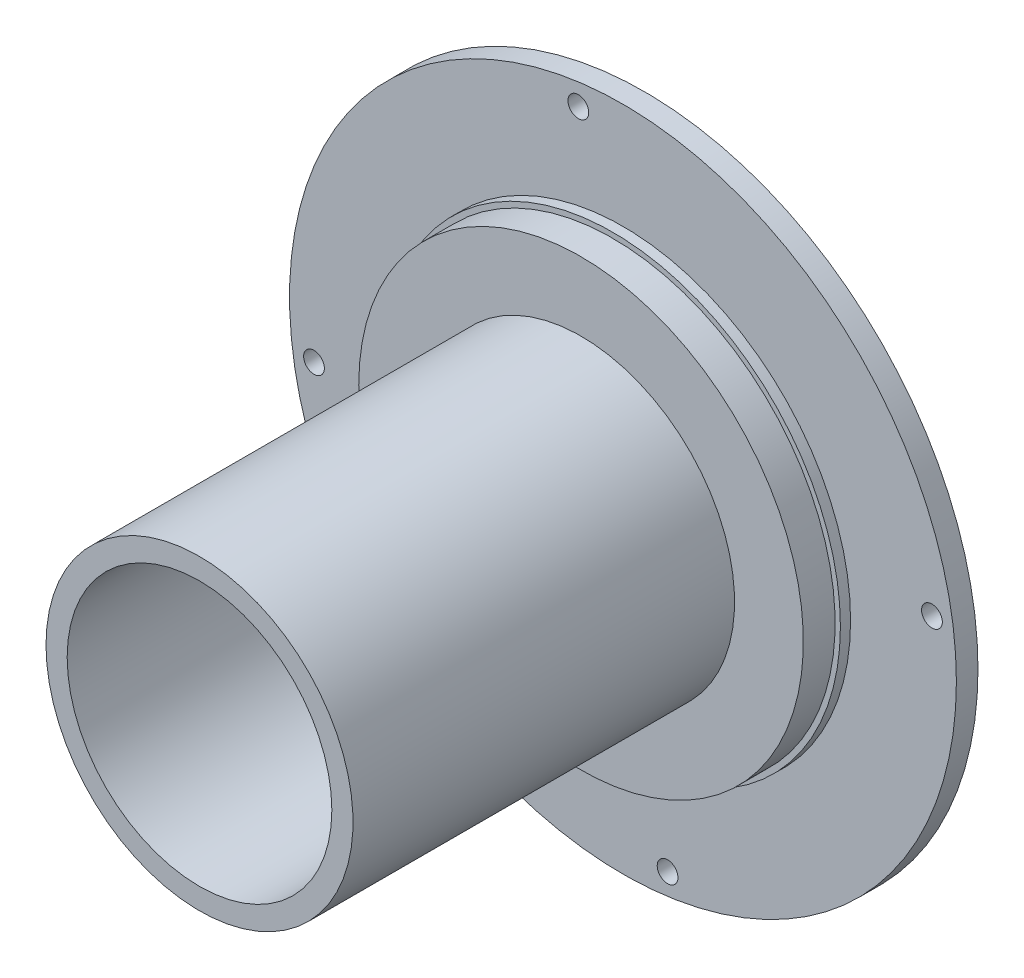
ISO-10303-21;
HEADER;
FILE_DESCRIPTION(('STEP AP214'),'2;1');
FILE_NAME('part.step','',(''),(''),'','','');
FILE_SCHEMA(('AUTOMOTIVE_DESIGN { 1 0 10303 214 1 1 1 1 }'));
ENDSEC;
DATA;
#1=APPLICATION_CONTEXT('core data for automotive mechanical design processes');
#2=APPLICATION_PROTOCOL_DEFINITION('international standard','automotive_design',2000,#1);
#3=PRODUCT_CONTEXT('',#1,'mechanical');
#4=PRODUCT('Part','Part','',(#3));
#5=PRODUCT_RELATED_PRODUCT_CATEGORY('part','',(#4));
#6=PRODUCT_DEFINITION_FORMATION('','',#4);
#7=PRODUCT_DEFINITION_CONTEXT('part definition',#1,'design');
#8=PRODUCT_DEFINITION('design','',#6,#7);
#9=PRODUCT_DEFINITION_SHAPE('','',#8);
#10=(LENGTH_UNIT() NAMED_UNIT(*) SI_UNIT(.MILLI.,.METRE.));
#11=(NAMED_UNIT(*) PLANE_ANGLE_UNIT() SI_UNIT($,.RADIAN.));
#12=(NAMED_UNIT(*) SI_UNIT($,.STERADIAN.) SOLID_ANGLE_UNIT());
#13=UNCERTAINTY_MEASURE_WITH_UNIT(LENGTH_MEASURE(1.E-05),#10,'distance_accuracy_value','');
#14=(GEOMETRIC_REPRESENTATION_CONTEXT(3) GLOBAL_UNCERTAINTY_ASSIGNED_CONTEXT((#13)) GLOBAL_UNIT_ASSIGNED_CONTEXT((#10,
#11,#12)) REPRESENTATION_CONTEXT('',''));
#15=CARTESIAN_POINT('',(0.,0.,0.));
#16=DIRECTION('',(0.,0.,1.));
#17=DIRECTION('',(1.,0.,0.));
#18=AXIS2_PLACEMENT_3D('',#15,#16,#17);
#19=CARTESIAN_POINT('',(0.,0.,5.1816));
#20=DIRECTION('',(0.,0.,1.));
#21=DIRECTION('',(1.,0.,0.));
#22=AXIS2_PLACEMENT_3D('',#19,#20,#21);
#23=PLANE('',#22);
#24=CARTESIAN_POINT('',(-74.1320200480575,-10.7052979685012,5.1816));
#25=DIRECTION('',(0.,0.,1.));
#26=DIRECTION('',(1.,0.,0.));
#27=AXIS2_PLACEMENT_3D('',#24,#25,#26);
#28=CIRCLE('',#27,2.4892);
#29=CARTESIAN_POINT('',(-71.6428200480575,-10.7052979685012,5.1816));
#30=VERTEX_POINT('',#29);
#31=EDGE_CURVE('E121',#30,#30,#28,.T.);
#32=ORIENTED_EDGE('',*,*,#31,.F.);
#33=EDGE_LOOP('',(#32));
#34=FACE_BOUND('',#33,.T.);
#35=CARTESIAN_POINT('',(-10.7052979685004,74.1320200480576,5.1816));
#36=DIRECTION('',(0.,0.,1.));
#37=DIRECTION('',(1.,0.,0.));
#38=AXIS2_PLACEMENT_3D('',#35,#36,#37);
#39=CIRCLE('',#38,2.4892);
#40=CARTESIAN_POINT('',(-8.21609796850041,74.1320200480576,5.1816));
#41=VERTEX_POINT('',#40);
#42=EDGE_CURVE('E113',#41,#41,#39,.T.);
#43=ORIENTED_EDGE('',*,*,#42,.F.);
#44=EDGE_LOOP('',(#43));
#45=FACE_BOUND('',#44,.T.);
#46=CARTESIAN_POINT('',(74.1320200480576,10.7052979685007,5.1816));
#47=DIRECTION('',(0.,0.,1.));
#48=DIRECTION('',(1.,0.,0.));
#49=AXIS2_PLACEMENT_3D('',#46,#47,#48);
#50=CIRCLE('',#49,2.4892);
#51=CARTESIAN_POINT('',(76.6212200480576,10.7052979685007,5.1816));
#52=VERTEX_POINT('',#51);
#53=EDGE_CURVE('E105',#52,#52,#50,.T.);
#54=ORIENTED_EDGE('',*,*,#53,.F.);
#55=EDGE_LOOP('',(#54));
#56=FACE_BOUND('',#55,.T.);
#57=CARTESIAN_POINT('',(10.7052979685004,-74.1320200480576,5.1816));
#58=DIRECTION('',(0.,0.,1.));
#59=DIRECTION('',(1.,0.,0.));
#60=AXIS2_PLACEMENT_3D('',#57,#58,#59);
#61=CIRCLE('',#60,2.4892);
#62=CARTESIAN_POINT('',(13.1944979685004,-74.1320200480576,5.1816));
#63=VERTEX_POINT('',#62);
#64=EDGE_CURVE('E97',#63,#63,#61,.T.);
#65=ORIENTED_EDGE('',*,*,#64,.F.);
#66=EDGE_LOOP('',(#65));
#67=FACE_BOUND('',#66,.T.);
#68=CARTESIAN_POINT('',(0.,0.,5.1816));
#69=DIRECTION('',(0.,0.,-1.));
#70=DIRECTION('',(-1.,0.,0.));
#71=AXIS2_PLACEMENT_3D('',#68,#69,#70);
#72=CIRCLE('',#71,54.61);
#73=CARTESIAN_POINT('',(-54.61,0.,5.1816));
#74=VERTEX_POINT('',#73);
#75=EDGE_CURVE('E62',#74,#74,#72,.T.);
#76=ORIENTED_EDGE('',*,*,#75,.T.);
#77=EDGE_LOOP('',(#76));
#78=FACE_BOUND('',#77,.T.);
#79=CARTESIAN_POINT('',(0.,0.,5.1816));
#80=DIRECTION('',(0.,0.,1.));
#81=DIRECTION('',(1.,0.,0.));
#82=AXIS2_PLACEMENT_3D('',#79,#80,#81);
#83=CIRCLE('',#82,80.);
#84=CARTESIAN_POINT('',(80.,0.,5.1816));
#85=VERTEX_POINT('',#84);
#86=EDGE_CURVE('E65',#85,#85,#83,.T.);
#87=ORIENTED_EDGE('',*,*,#86,.T.);
#88=EDGE_LOOP('',(#87));
#89=FACE_BOUND('',#88,.T.);
#90=ADVANCED_FACE('F45',(#34,#45,#56,#67,#78,#89),#23,.T.);
#91=CARTESIAN_POINT('',(0.,0.,0.));
#92=DIRECTION('',(0.,0.,1.));
#93=DIRECTION('',(1.,0.,0.));
#94=AXIS2_PLACEMENT_3D('',#91,#92,#93);
#95=PLANE('',#94);
#96=CARTESIAN_POINT('',(-74.1320200480575,-10.7052979685012,0.));
#97=DIRECTION('',(0.,0.,1.));
#98=DIRECTION('',(1.,0.,0.));
#99=AXIS2_PLACEMENT_3D('',#96,#97,#98);
#100=CIRCLE('',#99,2.4892);
#101=CARTESIAN_POINT('',(-71.6428200480575,-10.7052979685012,0.));
#102=VERTEX_POINT('',#101);
#103=EDGE_CURVE('E124',#102,#102,#100,.T.);
#104=ORIENTED_EDGE('',*,*,#103,.T.);
#105=EDGE_LOOP('',(#104));
#106=FACE_BOUND('',#105,.T.);
#107=CARTESIAN_POINT('',(-10.7052979685004,74.1320200480576,0.));
#108=DIRECTION('',(0.,0.,1.));
#109=DIRECTION('',(1.,0.,0.));
#110=AXIS2_PLACEMENT_3D('',#107,#108,#109);
#111=CIRCLE('',#110,2.4892);
#112=CARTESIAN_POINT('',(-8.21609796850041,74.1320200480576,0.));
#113=VERTEX_POINT('',#112);
#114=EDGE_CURVE('E117',#113,#113,#111,.T.);
#115=ORIENTED_EDGE('',*,*,#114,.T.);
#116=EDGE_LOOP('',(#115));
#117=FACE_BOUND('',#116,.T.);
#118=CARTESIAN_POINT('',(74.1320200480576,10.7052979685007,0.));
#119=DIRECTION('',(0.,0.,1.));
#120=DIRECTION('',(1.,0.,0.));
#121=AXIS2_PLACEMENT_3D('',#118,#119,#120);
#122=CIRCLE('',#121,2.4892);
#123=CARTESIAN_POINT('',(76.6212200480576,10.7052979685007,0.));
#124=VERTEX_POINT('',#123);
#125=EDGE_CURVE('E109',#124,#124,#122,.T.);
#126=ORIENTED_EDGE('',*,*,#125,.T.);
#127=EDGE_LOOP('',(#126));
#128=FACE_BOUND('',#127,.T.);
#129=CARTESIAN_POINT('',(10.7052979685004,-74.1320200480576,0.));
#130=DIRECTION('',(0.,0.,1.));
#131=DIRECTION('',(1.,0.,0.));
#132=AXIS2_PLACEMENT_3D('',#129,#130,#131);
#133=CIRCLE('',#132,2.4892);
#134=CARTESIAN_POINT('',(13.1944979685004,-74.1320200480576,0.));
#135=VERTEX_POINT('',#134);
#136=EDGE_CURVE('E102',#135,#135,#133,.T.);
#137=ORIENTED_EDGE('',*,*,#136,.T.);
#138=EDGE_LOOP('',(#137));
#139=FACE_BOUND('',#138,.T.);
#140=CARTESIAN_POINT('',(0.,0.,0.));
#141=DIRECTION('',(0.,0.,-1.));
#142=DIRECTION('',(-1.,0.,0.));
#143=AXIS2_PLACEMENT_3D('',#140,#141,#142);
#144=CIRCLE('',#143,31.75);
#145=CARTESIAN_POINT('',(-31.75,0.,0.));
#146=VERTEX_POINT('',#145);
#147=EDGE_CURVE('E10',#146,#146,#144,.T.);
#148=ORIENTED_EDGE('',*,*,#147,.F.);
#149=EDGE_LOOP('',(#148));
#150=FACE_BOUND('',#149,.T.);
#151=CARTESIAN_POINT('',(0.,0.,0.));
#152=DIRECTION('',(0.,0.,1.));
#153=DIRECTION('',(1.,0.,0.));
#154=AXIS2_PLACEMENT_3D('',#151,#152,#153);
#155=CIRCLE('',#154,80.);
#156=CARTESIAN_POINT('',(80.,0.,0.));
#157=VERTEX_POINT('',#156);
#158=EDGE_CURVE('E88',#157,#157,#155,.T.);
#159=ORIENTED_EDGE('',*,*,#158,.F.);
#160=EDGE_LOOP('',(#159));
#161=FACE_BOUND('',#160,.T.);
#162=ADVANCED_FACE('F128',(#106,#117,#128,#139,#150,#161),#95,.F.);
#163=CARTESIAN_POINT('',(0.,0.,15.24));
#164=DIRECTION('',(0.,0.,-1.));
#165=DIRECTION('',(-1.,0.,0.));
#166=AXIS2_PLACEMENT_3D('',#163,#164,#165);
#167=CYLINDRICAL_SURFACE('',#166,53.34);
#168=CARTESIAN_POINT('',(0.,0.,7.62));
#169=DIRECTION('',(0.,0.,-1.));
#170=DIRECTION('',(-1.,0.,0.));
#171=AXIS2_PLACEMENT_3D('',#168,#169,#170);
#172=CIRCLE('',#171,53.34);
#173=CARTESIAN_POINT('',(-53.34,0.,7.62));
#174=VERTEX_POINT('',#173);
#175=EDGE_CURVE('E81',#174,#174,#172,.F.);
#176=ORIENTED_EDGE('',*,*,#175,.T.);
#177=EDGE_LOOP('',(#176));
#178=FACE_BOUND('',#177,.T.);
#179=CARTESIAN_POINT('',(0.,0.,15.24));
#180=DIRECTION('',(0.,0.,-1.));
#181=DIRECTION('',(-1.,0.,0.));
#182=AXIS2_PLACEMENT_3D('',#179,#180,#181);
#183=CIRCLE('',#182,53.34);
#184=CARTESIAN_POINT('',(-53.34,0.,15.24));
#185=VERTEX_POINT('',#184);
#186=EDGE_CURVE('E49',#185,#185,#183,.F.);
#187=ORIENTED_EDGE('',*,*,#186,.F.);
#188=EDGE_LOOP('',(#187));
#189=FACE_BOUND('',#188,.T.);
#190=ADVANCED_FACE('F47',(#178,#189),#167,.T.);
#191=CARTESIAN_POINT('',(0.,0.,15.24));
#192=DIRECTION('',(0.,0.,1.));
#193=DIRECTION('',(1.,0.,0.));
#194=AXIS2_PLACEMENT_3D('',#191,#192,#193);
#195=PLANE('',#194);
#196=ORIENTED_EDGE('',*,*,#186,.T.);
#197=EDGE_LOOP('',(#196));
#198=FACE_BOUND('',#197,.T.);
#199=CARTESIAN_POINT('',(0.,0.,15.24));
#200=DIRECTION('',(0.,0.,-1.));
#201=DIRECTION('',(-1.,0.,0.));
#202=AXIS2_PLACEMENT_3D('',#199,#200,#201);
#203=CIRCLE('',#202,36.83);
#204=CARTESIAN_POINT('',(-36.83,0.,15.24));
#205=VERTEX_POINT('',#204);
#206=EDGE_CURVE('E78',#205,#205,#203,.F.);
#207=ORIENTED_EDGE('',*,*,#206,.F.);
#208=EDGE_LOOP('',(#207));
#209=FACE_BOUND('',#208,.T.);
#210=ADVANCED_FACE('F168',(#198,#209),#195,.T.);
#211=CARTESIAN_POINT('',(0.,0.,7.62));
#212=DIRECTION('',(0.,0.,-1.));
#213=DIRECTION('',(-1.,0.,0.));
#214=AXIS2_PLACEMENT_3D('',#211,#212,#213);
#215=PLANE('',#214);
#216=CARTESIAN_POINT('',(0.,0.,7.62));
#217=DIRECTION('',(0.,0.,-1.));
#218=DIRECTION('',(-1.,0.,0.));
#219=AXIS2_PLACEMENT_3D('',#216,#217,#218);
#220=CIRCLE('',#219,54.61);
#221=CARTESIAN_POINT('',(-54.61,0.,7.62));
#222=VERTEX_POINT('',#221);
#223=EDGE_CURVE('E74',#222,#222,#220,.T.);
#224=ORIENTED_EDGE('',*,*,#223,.F.);
#225=EDGE_LOOP('',(#224));
#226=FACE_BOUND('',#225,.T.);
#227=ORIENTED_EDGE('',*,*,#175,.F.);
#228=EDGE_LOOP('',(#227));
#229=FACE_BOUND('',#228,.T.);
#230=ADVANCED_FACE('F165',(#226,#229),#215,.F.);
#231=CARTESIAN_POINT('',(0.,0.,106.7816));
#232=DIRECTION('',(0.,0.,-1.));
#233=DIRECTION('',(-1.,0.,0.));
#234=AXIS2_PLACEMENT_3D('',#231,#232,#233);
#235=CYLINDRICAL_SURFACE('',#234,36.83);
#236=ORIENTED_EDGE('',*,*,#206,.T.);
#237=EDGE_LOOP('',(#236));
#238=FACE_BOUND('',#237,.T.);
#239=CARTESIAN_POINT('',(0.,0.,106.7816));
#240=DIRECTION('',(0.,0.,-1.));
#241=DIRECTION('',(-1.,0.,0.));
#242=AXIS2_PLACEMENT_3D('',#239,#240,#241);
#243=CIRCLE('',#242,36.83);
#244=CARTESIAN_POINT('',(-36.83,0.,106.7816));
#245=VERTEX_POINT('',#244);
#246=EDGE_CURVE('E71',#245,#245,#243,.F.);
#247=ORIENTED_EDGE('',*,*,#246,.F.);
#248=EDGE_LOOP('',(#247));
#249=FACE_BOUND('',#248,.T.);
#250=ADVANCED_FACE('F161',(#238,#249),#235,.T.);
#251=CARTESIAN_POINT('',(0.,0.,7.62));
#252=DIRECTION('',(0.,0.,-1.));
#253=DIRECTION('',(-1.,0.,0.));
#254=AXIS2_PLACEMENT_3D('',#251,#252,#253);
#255=CYLINDRICAL_SURFACE('',#254,54.61);
#256=ORIENTED_EDGE('',*,*,#75,.F.);
#257=EDGE_LOOP('',(#256));
#258=FACE_BOUND('',#257,.T.);
#259=ORIENTED_EDGE('',*,*,#223,.T.);
#260=EDGE_LOOP('',(#259));
#261=FACE_BOUND('',#260,.T.);
#262=ADVANCED_FACE('F157',(#258,#261),#255,.T.);
#263=CARTESIAN_POINT('',(0.,0.,106.7816));
#264=DIRECTION('',(0.,0.,1.));
#265=DIRECTION('',(1.,0.,0.));
#266=AXIS2_PLACEMENT_3D('',#263,#264,#265);
#267=PLANE('',#266);
#268=ORIENTED_EDGE('',*,*,#246,.T.);
#269=EDGE_LOOP('',(#268));
#270=FACE_BOUND('',#269,.T.);
#271=CARTESIAN_POINT('',(0.,0.,106.7816));
#272=DIRECTION('',(0.,0.,-1.));
#273=DIRECTION('',(-1.,0.,0.));
#274=AXIS2_PLACEMENT_3D('',#271,#272,#273);
#275=CIRCLE('',#274,31.75);
#276=CARTESIAN_POINT('',(-31.75,0.,106.7816));
#277=VERTEX_POINT('',#276);
#278=EDGE_CURVE('E54',#277,#277,#275,.T.);
#279=ORIENTED_EDGE('',*,*,#278,.T.);
#280=EDGE_LOOP('',(#279));
#281=FACE_BOUND('',#280,.T.);
#282=ADVANCED_FACE('F154',(#270,#281),#267,.T.);
#283=CARTESIAN_POINT('',(0.,0.,106.7816));
#284=DIRECTION('',(0.,0.,-1.));
#285=DIRECTION('',(-1.,0.,0.));
#286=AXIS2_PLACEMENT_3D('',#283,#284,#285);
#287=CYLINDRICAL_SURFACE('',#286,31.75);
#288=ORIENTED_EDGE('',*,*,#147,.T.);
#289=EDGE_LOOP('',(#288));
#290=FACE_BOUND('',#289,.T.);
#291=ORIENTED_EDGE('',*,*,#278,.F.);
#292=EDGE_LOOP('',(#291));
#293=FACE_BOUND('',#292,.T.);
#294=ADVANCED_FACE('F149',(#290,#293),#287,.F.);
#295=CARTESIAN_POINT('',(0.,0.,0.));
#296=DIRECTION('',(0.,0.,1.));
#297=DIRECTION('',(1.,0.,0.));
#298=AXIS2_PLACEMENT_3D('',#295,#296,#297);
#299=CYLINDRICAL_SURFACE('',#298,80.);
#300=ORIENTED_EDGE('',*,*,#158,.T.);
#301=EDGE_LOOP('',(#300));
#302=FACE_BOUND('',#301,.T.);
#303=ORIENTED_EDGE('',*,*,#86,.F.);
#304=EDGE_LOOP('',(#303));
#305=FACE_BOUND('',#304,.T.);
#306=ADVANCED_FACE('F174',(#302,#305),#299,.T.);
#307=CARTESIAN_POINT('',(10.7052979685004,-74.1320200480576,15.24));
#308=DIRECTION('',(0.,0.,1.));
#309=DIRECTION('',(1.,0.,0.));
#310=AXIS2_PLACEMENT_3D('',#307,#308,#309);
#311=CYLINDRICAL_SURFACE('',#310,2.4892);
#312=ORIENTED_EDGE('',*,*,#64,.T.);
#313=EDGE_LOOP('',(#312));
#314=FACE_BOUND('',#313,.T.);
#315=ORIENTED_EDGE('',*,*,#136,.F.);
#316=EDGE_LOOP('',(#315));
#317=FACE_BOUND('',#316,.T.);
#318=ADVANCED_FACE('F183',(#314,#317),#311,.F.);
#319=CARTESIAN_POINT('',(74.1320200480576,10.7052979685007,15.24));
#320=DIRECTION('',(0.,0.,1.));
#321=DIRECTION('',(1.,0.,0.));
#322=AXIS2_PLACEMENT_3D('',#319,#320,#321);
#323=CYLINDRICAL_SURFACE('',#322,2.4892);
#324=ORIENTED_EDGE('',*,*,#53,.T.);
#325=EDGE_LOOP('',(#324));
#326=FACE_BOUND('',#325,.T.);
#327=ORIENTED_EDGE('',*,*,#125,.F.);
#328=EDGE_LOOP('',(#327));
#329=FACE_BOUND('',#328,.T.);
#330=ADVANCED_FACE('F139',(#326,#329),#323,.F.);
#331=CARTESIAN_POINT('',(-10.7052979685004,74.1320200480576,15.24));
#332=DIRECTION('',(0.,0.,1.));
#333=DIRECTION('',(1.,0.,0.));
#334=AXIS2_PLACEMENT_3D('',#331,#332,#333);
#335=CYLINDRICAL_SURFACE('',#334,2.4892);
#336=ORIENTED_EDGE('',*,*,#42,.T.);
#337=EDGE_LOOP('',(#336));
#338=FACE_BOUND('',#337,.T.);
#339=ORIENTED_EDGE('',*,*,#114,.F.);
#340=EDGE_LOOP('',(#339));
#341=FACE_BOUND('',#340,.T.);
#342=ADVANCED_FACE('F133',(#338,#341),#335,.F.);
#343=CARTESIAN_POINT('',(-74.1320200480575,-10.7052979685012,15.24));
#344=DIRECTION('',(0.,0.,1.));
#345=DIRECTION('',(1.,0.,0.));
#346=AXIS2_PLACEMENT_3D('',#343,#344,#345);
#347=CYLINDRICAL_SURFACE('',#346,2.4892);
#348=ORIENTED_EDGE('',*,*,#31,.T.);
#349=EDGE_LOOP('',(#348));
#350=FACE_BOUND('',#349,.T.);
#351=ORIENTED_EDGE('',*,*,#103,.F.);
#352=EDGE_LOOP('',(#351));
#353=FACE_BOUND('',#352,.T.);
#354=ADVANCED_FACE('F131',(#350,#353),#347,.F.);
#355=CLOSED_SHELL('',(#90,#162,#190,#210,#230,#250,#262,#282,#294,#306,#318,#330,#342,#354));
#356=MANIFOLD_SOLID_BREP('B2',#355);
#357=ADVANCED_BREP_SHAPE_REPRESENTATION('',(#18,#356),#14);
#358=SHAPE_DEFINITION_REPRESENTATION(#9,#357);
ENDSEC;
END-ISO-10303-21;
